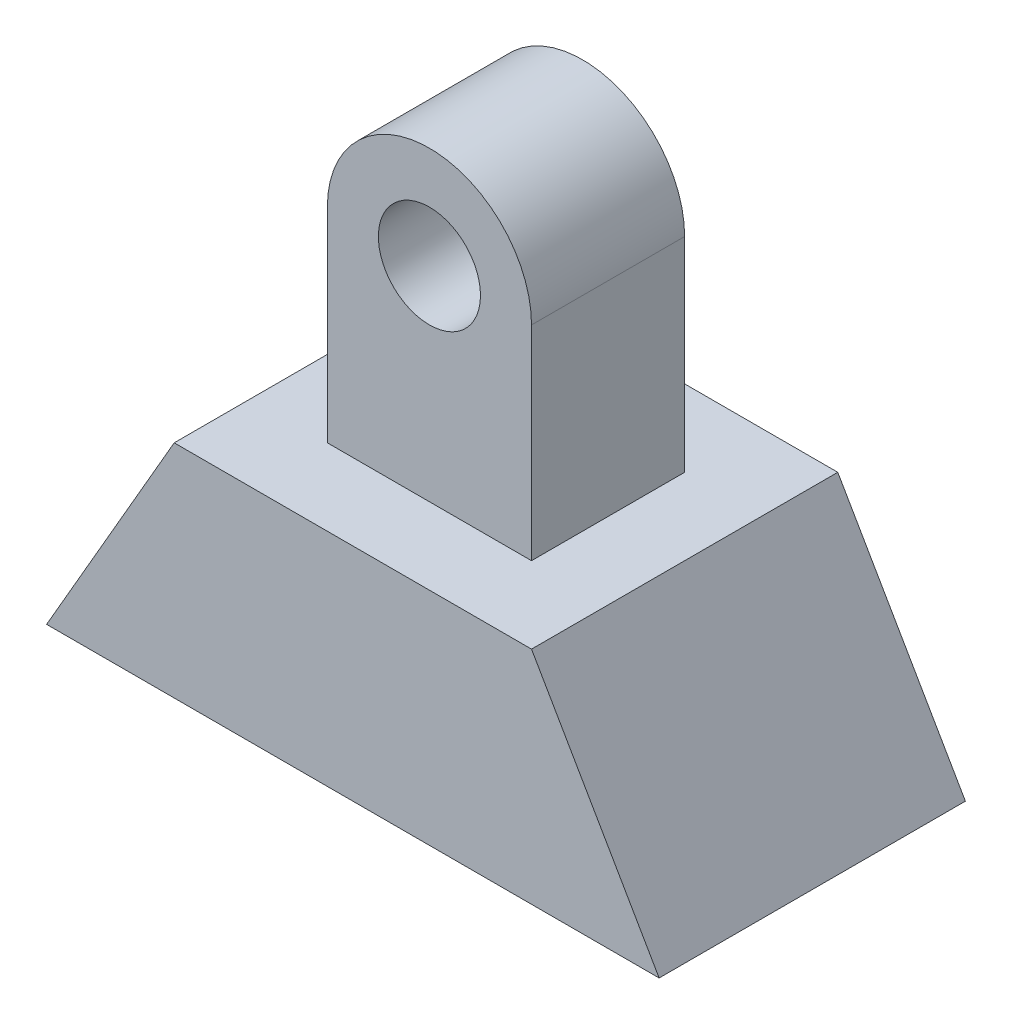
ISO-10303-21;
HEADER;
FILE_DESCRIPTION(('STEP AP214'),'2;1');
FILE_NAME('part.step','',(''),(''),'','','');
FILE_SCHEMA(('AUTOMOTIVE_DESIGN { 1 0 10303 214 1 1 1 1 }'));
ENDSEC;
DATA;
#1=APPLICATION_CONTEXT('core data for automotive mechanical design processes');
#2=APPLICATION_PROTOCOL_DEFINITION('international standard','automotive_design',2000,#1);
#3=PRODUCT_CONTEXT('',#1,'mechanical');
#4=PRODUCT('Part','Part','',(#3));
#5=PRODUCT_RELATED_PRODUCT_CATEGORY('part','',(#4));
#6=PRODUCT_DEFINITION_FORMATION('','',#4);
#7=PRODUCT_DEFINITION_CONTEXT('part definition',#1,'design');
#8=PRODUCT_DEFINITION('design','',#6,#7);
#9=PRODUCT_DEFINITION_SHAPE('','',#8);
#10=(LENGTH_UNIT() NAMED_UNIT(*) SI_UNIT(.MILLI.,.METRE.));
#11=(NAMED_UNIT(*) PLANE_ANGLE_UNIT() SI_UNIT($,.RADIAN.));
#12=(NAMED_UNIT(*) SI_UNIT($,.STERADIAN.) SOLID_ANGLE_UNIT());
#13=UNCERTAINTY_MEASURE_WITH_UNIT(LENGTH_MEASURE(1.E-05),#10,'distance_accuracy_value','');
#14=(GEOMETRIC_REPRESENTATION_CONTEXT(3) GLOBAL_UNCERTAINTY_ASSIGNED_CONTEXT((#13)) GLOBAL_UNIT_ASSIGNED_CONTEXT((#10,
#11,#12)) REPRESENTATION_CONTEXT('',''));
#15=CARTESIAN_POINT('',(0.,0.,0.));
#16=DIRECTION('',(0.,0.,1.));
#17=DIRECTION('',(1.,0.,0.));
#18=AXIS2_PLACEMENT_3D('',#15,#16,#17);
#19=CARTESIAN_POINT('',(35.,21.6506350946107,30.));
#20=DIRECTION('',(0.,-1.,0.));
#21=DIRECTION('',(0.,0.,-1.));
#22=AXIS2_PLACEMENT_3D('',#19,#20,#21);
#23=PLANE('',#22);
#24=DIRECTION('',(-1.,0.,0.));
#25=VECTOR('',#24,1.);
#26=CARTESIAN_POINT('',(35.,21.6506350946107,-30.));
#27=LINE('',#26,#25);
#28=CARTESIAN_POINT('',(35.,21.6506350946107,-30.));
#29=VERTEX_POINT('',#28);
#30=CARTESIAN_POINT('',(-35.,21.6506350946107,-30.));
#31=VERTEX_POINT('',#30);
#32=EDGE_CURVE('E139',#29,#31,#27,.T.);
#33=ORIENTED_EDGE('',*,*,#32,.T.);
#34=DIRECTION('',(0.,0.,-1.));
#35=VECTOR('',#34,1.);
#36=CARTESIAN_POINT('',(-35.,21.6506350946107,30.));
#37=LINE('',#36,#35);
#38=CARTESIAN_POINT('',(-35.,21.6506350946107,30.));
#39=VERTEX_POINT('',#38);
#40=EDGE_CURVE('E145',#39,#31,#37,.T.);
#41=ORIENTED_EDGE('',*,*,#40,.F.);
#42=DIRECTION('',(-1.,0.,0.));
#43=VECTOR('',#42,1.);
#44=CARTESIAN_POINT('',(35.,21.6506350946107,30.));
#45=LINE('',#44,#43);
#46=CARTESIAN_POINT('',(35.,21.6506350946107,30.));
#47=VERTEX_POINT('',#46);
#48=EDGE_CURVE('E143',#47,#39,#45,.T.);
#49=ORIENTED_EDGE('',*,*,#48,.F.);
#50=DIRECTION('',(0.,0.,-1.));
#51=VECTOR('',#50,1.);
#52=CARTESIAN_POINT('',(35.,21.6506350946107,30.));
#53=LINE('',#52,#51);
#54=EDGE_CURVE('E155',#47,#29,#53,.T.);
#55=ORIENTED_EDGE('',*,*,#54,.T.);
#56=EDGE_LOOP('',(#33,#41,#49,#55));
#57=FACE_BOUND('',#56,.T.);
#58=DIRECTION('',(0.,0.,-1.));
#59=VECTOR('',#58,1.);
#60=CARTESIAN_POINT('',(20.,21.6506350946107,15.));
#61=LINE('',#60,#59);
#62=CARTESIAN_POINT('',(20.,21.6506350946107,15.));
#63=VERTEX_POINT('',#62);
#64=CARTESIAN_POINT('',(20.,21.6506350946107,-15.));
#65=VERTEX_POINT('',#64);
#66=EDGE_CURVE('E47',#63,#65,#61,.T.);
#67=ORIENTED_EDGE('',*,*,#66,.F.);
#68=DIRECTION('',(1.,0.,0.));
#69=VECTOR('',#68,1.);
#70=CARTESIAN_POINT('',(-20.,21.6506350946107,15.));
#71=LINE('',#70,#69);
#72=CARTESIAN_POINT('',(-20.,21.6506350946107,15.));
#73=VERTEX_POINT('',#72);
#74=EDGE_CURVE('E103',#73,#63,#71,.T.);
#75=ORIENTED_EDGE('',*,*,#74,.F.);
#76=DIRECTION('',(0.,0.,-1.));
#77=VECTOR('',#76,1.);
#78=CARTESIAN_POINT('',(-20.,21.6506350946107,15.));
#79=LINE('',#78,#77);
#80=CARTESIAN_POINT('',(-20.,21.6506350946107,-15.));
#81=VERTEX_POINT('',#80);
#82=EDGE_CURVE('E119',#73,#81,#79,.T.);
#83=ORIENTED_EDGE('',*,*,#82,.T.);
#84=DIRECTION('',(1.,0.,0.));
#85=VECTOR('',#84,1.);
#86=CARTESIAN_POINT('',(-20.,21.6506350946107,-15.));
#87=LINE('',#86,#85);
#88=EDGE_CURVE('E52',#81,#65,#87,.T.);
#89=ORIENTED_EDGE('',*,*,#88,.T.);
#90=EDGE_LOOP('',(#67,#75,#83,#89));
#91=FACE_BOUND('',#90,.T.);
#92=ADVANCED_FACE('F32',(#57,#91),#23,.F.);
#93=CARTESIAN_POINT('',(-35.,21.6506350946107,30.));
#94=DIRECTION('',(0.866025403784436,-0.500000000000004,0.));
#95=DIRECTION('',(0.500000000000004,0.866025403784436,0.));
#96=AXIS2_PLACEMENT_3D('',#93,#94,#95);
#97=PLANE('',#96);
#98=DIRECTION('',(-0.500000000000004,-0.866025403784436,0.));
#99=VECTOR('',#98,1.);
#100=CARTESIAN_POINT('',(-35.,21.6506350946107,-30.));
#101=LINE('',#100,#99);
#102=CARTESIAN_POINT('',(-60.,-21.6506350946108,-30.));
#103=VERTEX_POINT('',#102);
#104=EDGE_CURVE('E134',#31,#103,#101,.T.);
#105=ORIENTED_EDGE('',*,*,#104,.T.);
#106=DIRECTION('',(0.,0.,-1.));
#107=VECTOR('',#106,1.);
#108=CARTESIAN_POINT('',(-60.,-21.6506350946108,30.));
#109=LINE('',#108,#107);
#110=CARTESIAN_POINT('',(-60.,-21.6506350946108,30.));
#111=VERTEX_POINT('',#110);
#112=EDGE_CURVE('E11',#111,#103,#109,.T.);
#113=ORIENTED_EDGE('',*,*,#112,.F.);
#114=DIRECTION('',(-0.500000000000004,-0.866025403784436,0.));
#115=VECTOR('',#114,1.);
#116=CARTESIAN_POINT('',(-35.,21.6506350946107,30.));
#117=LINE('',#116,#115);
#118=EDGE_CURVE('E135',#39,#111,#117,.T.);
#119=ORIENTED_EDGE('',*,*,#118,.F.);
#120=ORIENTED_EDGE('',*,*,#40,.T.);
#121=EDGE_LOOP('',(#105,#113,#119,#120));
#122=FACE_BOUND('',#121,.T.);
#123=ADVANCED_FACE('F34',(#122),#97,.F.);
#124=CARTESIAN_POINT('',(-60.,-21.6506350946108,30.));
#125=DIRECTION('',(0.,1.,0.));
#126=DIRECTION('',(0.,0.,1.));
#127=AXIS2_PLACEMENT_3D('',#124,#125,#126);
#128=PLANE('',#127);
#129=DIRECTION('',(1.,0.,0.));
#130=VECTOR('',#129,1.);
#131=CARTESIAN_POINT('',(-60.,-21.6506350946108,-30.));
#132=LINE('',#131,#130);
#133=CARTESIAN_POINT('',(60.,-21.6506350946108,-30.));
#134=VERTEX_POINT('',#133);
#135=EDGE_CURVE('E148',#103,#134,#132,.T.);
#136=ORIENTED_EDGE('',*,*,#135,.T.);
#137=DIRECTION('',(0.,0.,-1.));
#138=VECTOR('',#137,1.);
#139=CARTESIAN_POINT('',(60.,-21.6506350946108,30.));
#140=LINE('',#139,#138);
#141=CARTESIAN_POINT('',(60.,-21.6506350946108,30.));
#142=VERTEX_POINT('',#141);
#143=EDGE_CURVE('E40',#142,#134,#140,.T.);
#144=ORIENTED_EDGE('',*,*,#143,.F.);
#145=DIRECTION('',(1.,0.,0.));
#146=VECTOR('',#145,1.);
#147=CARTESIAN_POINT('',(-60.,-21.6506350946108,30.));
#148=LINE('',#147,#146);
#149=EDGE_CURVE('E138',#111,#142,#148,.T.);
#150=ORIENTED_EDGE('',*,*,#149,.F.);
#151=ORIENTED_EDGE('',*,*,#112,.T.);
#152=EDGE_LOOP('',(#136,#144,#150,#151));
#153=FACE_BOUND('',#152,.T.);
#154=ADVANCED_FACE('F177',(#153),#128,.F.);
#155=CARTESIAN_POINT('',(60.,-21.6506350946108,30.));
#156=DIRECTION('',(-0.866025403784436,-0.500000000000004,0.));
#157=DIRECTION('',(0.500000000000004,-0.866025403784436,0.));
#158=AXIS2_PLACEMENT_3D('',#155,#156,#157);
#159=PLANE('',#158);
#160=DIRECTION('',(-0.500000000000004,0.866025403784436,0.));
#161=VECTOR('',#160,1.);
#162=CARTESIAN_POINT('',(60.,-21.6506350946108,-30.));
#163=LINE('',#162,#161);
#164=EDGE_CURVE('E150',#134,#29,#163,.T.);
#165=ORIENTED_EDGE('',*,*,#164,.T.);
#166=ORIENTED_EDGE('',*,*,#54,.F.);
#167=DIRECTION('',(-0.500000000000004,0.866025403784436,0.));
#168=VECTOR('',#167,1.);
#169=CARTESIAN_POINT('',(60.,-21.6506350946108,30.));
#170=LINE('',#169,#168);
#171=EDGE_CURVE('E141',#142,#47,#170,.T.);
#172=ORIENTED_EDGE('',*,*,#171,.F.);
#173=ORIENTED_EDGE('',*,*,#143,.T.);
#174=EDGE_LOOP('',(#165,#166,#172,#173));
#175=FACE_BOUND('',#174,.T.);
#176=ADVANCED_FACE('F162',(#175),#159,.F.);
#177=CARTESIAN_POINT('',(0.,0.,30.));
#178=DIRECTION('',(0.,0.,1.));
#179=DIRECTION('',(1.,0.,0.));
#180=AXIS2_PLACEMENT_3D('',#177,#178,#179);
#181=PLANE('',#180);
#182=ORIENTED_EDGE('',*,*,#118,.T.);
#183=ORIENTED_EDGE('',*,*,#149,.T.);
#184=ORIENTED_EDGE('',*,*,#171,.T.);
#185=ORIENTED_EDGE('',*,*,#48,.T.);
#186=EDGE_LOOP('',(#182,#183,#184,#185));
#187=FACE_BOUND('',#186,.T.);
#188=ADVANCED_FACE('F176',(#187),#181,.T.);
#189=CARTESIAN_POINT('',(0.,0.,-30.));
#190=DIRECTION('',(0.,0.,1.));
#191=DIRECTION('',(1.,0.,0.));
#192=AXIS2_PLACEMENT_3D('',#189,#190,#191);
#193=PLANE('',#192);
#194=ORIENTED_EDGE('',*,*,#104,.F.);
#195=ORIENTED_EDGE('',*,*,#32,.F.);
#196=ORIENTED_EDGE('',*,*,#164,.F.);
#197=ORIENTED_EDGE('',*,*,#135,.F.);
#198=EDGE_LOOP('',(#194,#195,#196,#197));
#199=FACE_BOUND('',#198,.T.);
#200=ADVANCED_FACE('F168',(#199),#193,.F.);
#201=CARTESIAN_POINT('',(0.,61.6506350946107,15.));
#202=DIRECTION('',(0.,0.,1.));
#203=DIRECTION('',(1.,0.,0.));
#204=AXIS2_PLACEMENT_3D('',#201,#202,#203);
#205=PLANE('',#204);
#206=ORIENTED_EDGE('',*,*,#74,.T.);
#207=DIRECTION('',(0.,1.,0.));
#208=VECTOR('',#207,1.);
#209=CARTESIAN_POINT('',(20.,21.6506350946107,15.));
#210=LINE('',#209,#208);
#211=CARTESIAN_POINT('',(20.,61.6506350946107,15.));
#212=VERTEX_POINT('',#211);
#213=EDGE_CURVE('E95',#63,#212,#210,.T.);
#214=ORIENTED_EDGE('',*,*,#213,.T.);
#215=CARTESIAN_POINT('',(0.,61.6506350946107,15.));
#216=DIRECTION('',(0.,0.,1.));
#217=DIRECTION('',(1.,0.,0.));
#218=AXIS2_PLACEMENT_3D('',#215,#216,#217);
#219=CIRCLE('',#218,20.);
#220=CARTESIAN_POINT('',(-20.,61.6506350946107,15.));
#221=VERTEX_POINT('',#220);
#222=EDGE_CURVE('E101',#212,#221,#219,.T.);
#223=ORIENTED_EDGE('',*,*,#222,.T.);
#224=DIRECTION('',(0.,-1.,0.));
#225=VECTOR('',#224,1.);
#226=CARTESIAN_POINT('',(-20.,21.6506350946107,15.));
#227=LINE('',#226,#225);
#228=EDGE_CURVE('E117',#221,#73,#227,.T.);
#229=ORIENTED_EDGE('',*,*,#228,.T.);
#230=EDGE_LOOP('',(#206,#214,#223,#229));
#231=FACE_BOUND('',#230,.T.);
#232=CARTESIAN_POINT('',(0.,61.6506350946107,15.));
#233=DIRECTION('',(0.,0.,1.));
#234=DIRECTION('',(1.,0.,0.));
#235=AXIS2_PLACEMENT_3D('',#232,#233,#234);
#236=CIRCLE('',#235,10.);
#237=CARTESIAN_POINT('',(10.,61.6506350946107,15.));
#238=VERTEX_POINT('',#237);
#239=EDGE_CURVE('E124',#238,#238,#236,.T.);
#240=ORIENTED_EDGE('',*,*,#239,.F.);
#241=EDGE_LOOP('',(#240));
#242=FACE_BOUND('',#241,.T.);
#243=ADVANCED_FACE('F97',(#231,#242),#205,.T.);
#244=CARTESIAN_POINT('',(0.,61.6506350946107,-15.));
#245=DIRECTION('',(0.,0.,1.));
#246=DIRECTION('',(1.,0.,0.));
#247=AXIS2_PLACEMENT_3D('',#244,#245,#246);
#248=PLANE('',#247);
#249=ORIENTED_EDGE('',*,*,#88,.F.);
#250=DIRECTION('',(0.,-1.,0.));
#251=VECTOR('',#250,1.);
#252=CARTESIAN_POINT('',(-20.,21.6506350946107,-15.));
#253=LINE('',#252,#251);
#254=CARTESIAN_POINT('',(-20.,61.6506350946107,-15.));
#255=VERTEX_POINT('',#254);
#256=EDGE_CURVE('E128',#255,#81,#253,.T.);
#257=ORIENTED_EDGE('',*,*,#256,.F.);
#258=CARTESIAN_POINT('',(0.,61.6506350946107,-15.));
#259=DIRECTION('',(0.,0.,1.));
#260=DIRECTION('',(1.,0.,0.));
#261=AXIS2_PLACEMENT_3D('',#258,#259,#260);
#262=CIRCLE('',#261,20.);
#263=CARTESIAN_POINT('',(20.,61.6506350946107,-15.));
#264=VERTEX_POINT('',#263);
#265=EDGE_CURVE('E126',#264,#255,#262,.T.);
#266=ORIENTED_EDGE('',*,*,#265,.F.);
#267=DIRECTION('',(0.,1.,0.));
#268=VECTOR('',#267,1.);
#269=CARTESIAN_POINT('',(20.,21.6506350946107,-15.));
#270=LINE('',#269,#268);
#271=EDGE_CURVE('E109',#65,#264,#270,.T.);
#272=ORIENTED_EDGE('',*,*,#271,.F.);
#273=EDGE_LOOP('',(#249,#257,#266,#272));
#274=FACE_BOUND('',#273,.T.);
#275=CARTESIAN_POINT('',(0.,61.6506350946107,-15.));
#276=DIRECTION('',(0.,0.,1.));
#277=DIRECTION('',(1.,0.,0.));
#278=AXIS2_PLACEMENT_3D('',#275,#276,#277);
#279=CIRCLE('',#278,10.);
#280=CARTESIAN_POINT('',(10.,61.6506350946107,-15.));
#281=VERTEX_POINT('',#280);
#282=EDGE_CURVE('E217',#281,#281,#279,.T.);
#283=ORIENTED_EDGE('',*,*,#282,.T.);
#284=EDGE_LOOP('',(#283));
#285=FACE_BOUND('',#284,.T.);
#286=ADVANCED_FACE('F195',(#274,#285),#248,.F.);
#287=CARTESIAN_POINT('',(20.,21.6506350946107,15.));
#288=DIRECTION('',(-1.,0.,0.));
#289=DIRECTION('',(0.,0.,1.));
#290=AXIS2_PLACEMENT_3D('',#287,#288,#289);
#291=PLANE('',#290);
#292=ORIENTED_EDGE('',*,*,#271,.T.);
#293=DIRECTION('',(0.,0.,-1.));
#294=VECTOR('',#293,1.);
#295=CARTESIAN_POINT('',(20.,61.6506350946107,15.));
#296=LINE('',#295,#294);
#297=EDGE_CURVE('E107',#212,#264,#296,.T.);
#298=ORIENTED_EDGE('',*,*,#297,.F.);
#299=ORIENTED_EDGE('',*,*,#213,.F.);
#300=ORIENTED_EDGE('',*,*,#66,.T.);
#301=EDGE_LOOP('',(#292,#298,#299,#300));
#302=FACE_BOUND('',#301,.T.);
#303=ADVANCED_FACE('F108',(#302),#291,.F.);
#304=CARTESIAN_POINT('',(0.,61.6506350946107,15.));
#305=DIRECTION('',(0.,0.,-1.));
#306=DIRECTION('',(-1.,0.,0.));
#307=AXIS2_PLACEMENT_3D('',#304,#305,#306);
#308=CYLINDRICAL_SURFACE('',#307,20.);
#309=ORIENTED_EDGE('',*,*,#265,.T.);
#310=DIRECTION('',(0.,0.,-1.));
#311=VECTOR('',#310,1.);
#312=CARTESIAN_POINT('',(-20.,61.6506350946107,15.));
#313=LINE('',#312,#311);
#314=EDGE_CURVE('E112',#221,#255,#313,.T.);
#315=ORIENTED_EDGE('',*,*,#314,.F.);
#316=ORIENTED_EDGE('',*,*,#222,.F.);
#317=ORIENTED_EDGE('',*,*,#297,.T.);
#318=EDGE_LOOP('',(#309,#315,#316,#317));
#319=FACE_BOUND('',#318,.T.);
#320=ADVANCED_FACE('F114',(#319),#308,.T.);
#321=CARTESIAN_POINT('',(-20.,21.6506350946107,15.));
#322=DIRECTION('',(1.,0.,0.));
#323=DIRECTION('',(0.,0.,-1.));
#324=AXIS2_PLACEMENT_3D('',#321,#322,#323);
#325=PLANE('',#324);
#326=ORIENTED_EDGE('',*,*,#256,.T.);
#327=ORIENTED_EDGE('',*,*,#82,.F.);
#328=ORIENTED_EDGE('',*,*,#228,.F.);
#329=ORIENTED_EDGE('',*,*,#314,.T.);
#330=EDGE_LOOP('',(#326,#327,#328,#329));
#331=FACE_BOUND('',#330,.T.);
#332=ADVANCED_FACE('F198',(#331),#325,.F.);
#333=CARTESIAN_POINT('',(0.,61.6506350946107,15.));
#334=DIRECTION('',(0.,0.,-1.));
#335=DIRECTION('',(-1.,0.,0.));
#336=AXIS2_PLACEMENT_3D('',#333,#334,#335);
#337=CYLINDRICAL_SURFACE('',#336,10.);
#338=ORIENTED_EDGE('',*,*,#239,.T.);
#339=EDGE_LOOP('',(#338));
#340=FACE_BOUND('',#339,.T.);
#341=ORIENTED_EDGE('',*,*,#282,.F.);
#342=EDGE_LOOP('',(#341));
#343=FACE_BOUND('',#342,.T.);
#344=ADVANCED_FACE('F201',(#340,#343),#337,.F.);
#345=CLOSED_SHELL('',(#92,#123,#154,#176,#188,#200,#243,#286,#303,#320,#332,#344));
#346=MANIFOLD_SOLID_BREP('B2',#345);
#347=ADVANCED_BREP_SHAPE_REPRESENTATION('',(#18,#346),#14);
#348=SHAPE_DEFINITION_REPRESENTATION(#9,#347);
ENDSEC;
END-ISO-10303-21;
